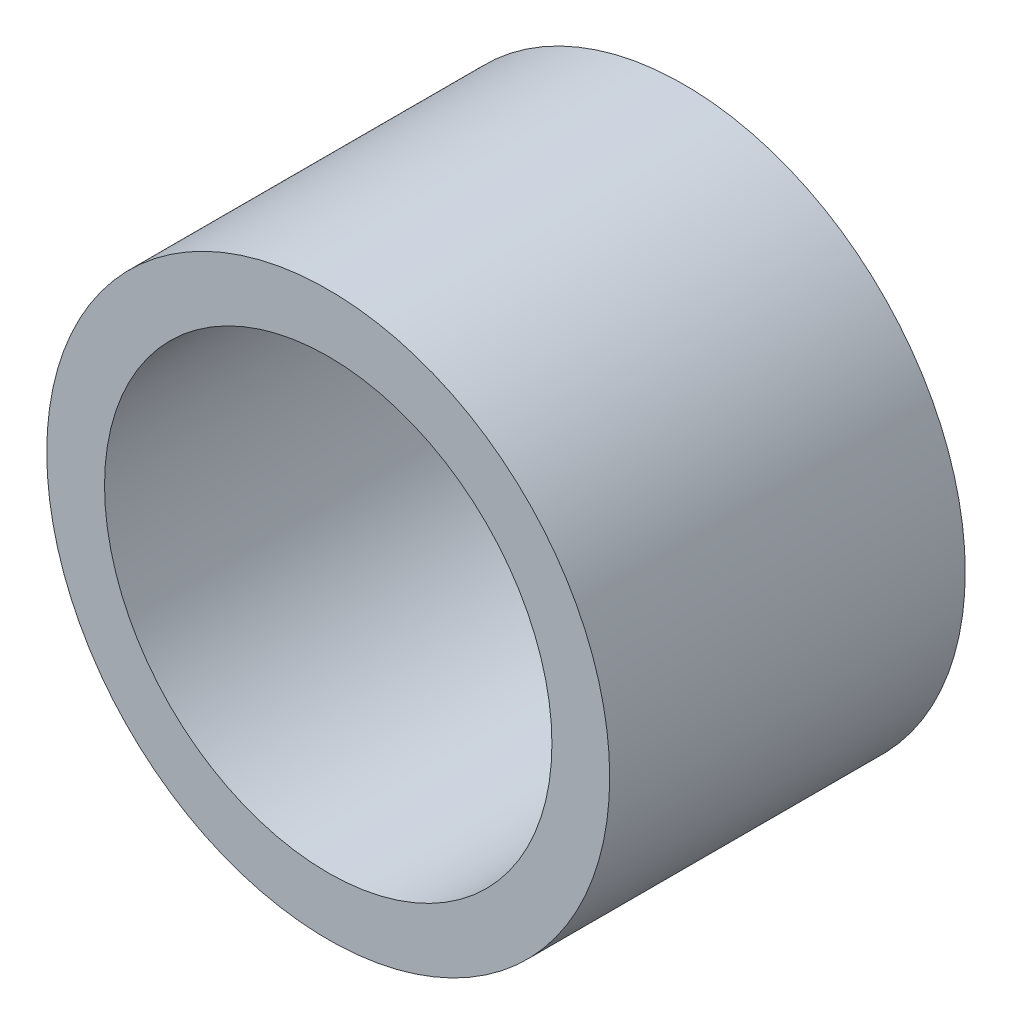
ISO-10303-21;
HEADER;
FILE_DESCRIPTION(('STEP AP214'),'2;1');
FILE_NAME('part.step','',(''),(''),'','','');
FILE_SCHEMA(('AUTOMOTIVE_DESIGN { 1 0 10303 214 1 1 1 1 }'));
ENDSEC;
DATA;
#1=APPLICATION_CONTEXT('core data for automotive mechanical design processes');
#2=APPLICATION_PROTOCOL_DEFINITION('international standard','automotive_design',2000,#1);
#3=PRODUCT_CONTEXT('',#1,'mechanical');
#4=PRODUCT('Part','Part','',(#3));
#5=PRODUCT_RELATED_PRODUCT_CATEGORY('part','',(#4));
#6=PRODUCT_DEFINITION_FORMATION('','',#4);
#7=PRODUCT_DEFINITION_CONTEXT('part definition',#1,'design');
#8=PRODUCT_DEFINITION('design','',#6,#7);
#9=PRODUCT_DEFINITION_SHAPE('','',#8);
#10=(LENGTH_UNIT() NAMED_UNIT(*) SI_UNIT(.MILLI.,.METRE.));
#11=(NAMED_UNIT(*) PLANE_ANGLE_UNIT() SI_UNIT($,.RADIAN.));
#12=(NAMED_UNIT(*) SI_UNIT($,.STERADIAN.) SOLID_ANGLE_UNIT());
#13=UNCERTAINTY_MEASURE_WITH_UNIT(LENGTH_MEASURE(1.E-05),#10,'distance_accuracy_value','');
#14=(GEOMETRIC_REPRESENTATION_CONTEXT(3) GLOBAL_UNCERTAINTY_ASSIGNED_CONTEXT((#13)) GLOBAL_UNIT_ASSIGNED_CONTEXT((#10,
#11,#12)) REPRESENTATION_CONTEXT('',''));
#15=CARTESIAN_POINT('',(0.,0.,0.));
#16=DIRECTION('',(0.,0.,1.));
#17=DIRECTION('',(1.,0.,0.));
#18=AXIS2_PLACEMENT_3D('',#15,#16,#17);
#19=CARTESIAN_POINT('',(0.,0.,12.));
#20=DIRECTION('',(0.,0.,1.));
#21=DIRECTION('',(1.,0.,0.));
#22=AXIS2_PLACEMENT_3D('',#19,#20,#21);
#23=PLANE('',#22);
#24=CARTESIAN_POINT('',(0.,0.,12.));
#25=DIRECTION('',(0.,0.,1.));
#26=DIRECTION('',(1.,0.,0.));
#27=AXIS2_PLACEMENT_3D('',#24,#25,#26);
#28=CIRCLE('',#27,19.);
#29=CARTESIAN_POINT('',(19.,0.,12.));
#30=VERTEX_POINT('',#29);
#31=EDGE_CURVE('E10',#30,#30,#28,.T.);
#32=ORIENTED_EDGE('',*,*,#31,.T.);
#33=EDGE_LOOP('',(#32));
#34=FACE_BOUND('',#33,.T.);
#35=CARTESIAN_POINT('',(0.,0.,12.));
#36=DIRECTION('',(0.,0.,1.));
#37=DIRECTION('',(1.,0.,0.));
#38=AXIS2_PLACEMENT_3D('',#35,#36,#37);
#39=CIRCLE('',#38,15.1);
#40=CARTESIAN_POINT('',(15.1,0.,12.));
#41=VERTEX_POINT('',#40);
#42=EDGE_CURVE('E49',#41,#41,#39,.T.);
#43=ORIENTED_EDGE('',*,*,#42,.F.);
#44=EDGE_LOOP('',(#43));
#45=FACE_BOUND('',#44,.T.);
#46=ADVANCED_FACE('F39',(#34,#45),#23,.T.);
#47=CARTESIAN_POINT('',(0.,0.,-12.));
#48=DIRECTION('',(0.,0.,1.));
#49=DIRECTION('',(1.,0.,0.));
#50=AXIS2_PLACEMENT_3D('',#47,#48,#49);
#51=PLANE('',#50);
#52=CARTESIAN_POINT('',(0.,0.,-12.));
#53=DIRECTION('',(0.,0.,1.));
#54=DIRECTION('',(1.,0.,0.));
#55=AXIS2_PLACEMENT_3D('',#52,#53,#54);
#56=CIRCLE('',#55,19.);
#57=CARTESIAN_POINT('',(19.,0.,-12.));
#58=VERTEX_POINT('',#57);
#59=EDGE_CURVE('E43',#58,#58,#56,.T.);
#60=ORIENTED_EDGE('',*,*,#59,.F.);
#61=EDGE_LOOP('',(#60));
#62=FACE_BOUND('',#61,.T.);
#63=CARTESIAN_POINT('',(0.,0.,-12.));
#64=DIRECTION('',(0.,0.,1.));
#65=DIRECTION('',(1.,0.,0.));
#66=AXIS2_PLACEMENT_3D('',#63,#64,#65);
#67=CIRCLE('',#66,15.1);
#68=CARTESIAN_POINT('',(15.1,0.,-12.));
#69=VERTEX_POINT('',#68);
#70=EDGE_CURVE('E55',#69,#69,#67,.T.);
#71=ORIENTED_EDGE('',*,*,#70,.T.);
#72=EDGE_LOOP('',(#71));
#73=FACE_BOUND('',#72,.T.);
#74=ADVANCED_FACE('F62',(#62,#73),#51,.F.);
#75=CARTESIAN_POINT('',(0.,0.,12.));
#76=DIRECTION('',(0.,0.,-1.));
#77=DIRECTION('',(-1.,0.,0.));
#78=AXIS2_PLACEMENT_3D('',#75,#76,#77);
#79=CYLINDRICAL_SURFACE('',#78,19.);
#80=ORIENTED_EDGE('',*,*,#31,.F.);
#81=EDGE_LOOP('',(#80));
#82=FACE_BOUND('',#81,.T.);
#83=ORIENTED_EDGE('',*,*,#59,.T.);
#84=EDGE_LOOP('',(#83));
#85=FACE_BOUND('',#84,.T.);
#86=ADVANCED_FACE('F41',(#82,#85),#79,.T.);
#87=CARTESIAN_POINT('',(0.,0.,12.));
#88=DIRECTION('',(0.,0.,-1.));
#89=DIRECTION('',(-1.,0.,0.));
#90=AXIS2_PLACEMENT_3D('',#87,#88,#89);
#91=CYLINDRICAL_SURFACE('',#90,15.1);
#92=ORIENTED_EDGE('',*,*,#42,.T.);
#93=EDGE_LOOP('',(#92));
#94=FACE_BOUND('',#93,.T.);
#95=ORIENTED_EDGE('',*,*,#70,.F.);
#96=EDGE_LOOP('',(#95));
#97=FACE_BOUND('',#96,.T.);
#98=ADVANCED_FACE('F59',(#94,#97),#91,.F.);
#99=CLOSED_SHELL('',(#46,#74,#86,#98));
#100=MANIFOLD_SOLID_BREP('B2',#99);
#101=ADVANCED_BREP_SHAPE_REPRESENTATION('',(#18,#100),#14);
#102=SHAPE_DEFINITION_REPRESENTATION(#9,#101);
ENDSEC;
END-ISO-10303-21;
